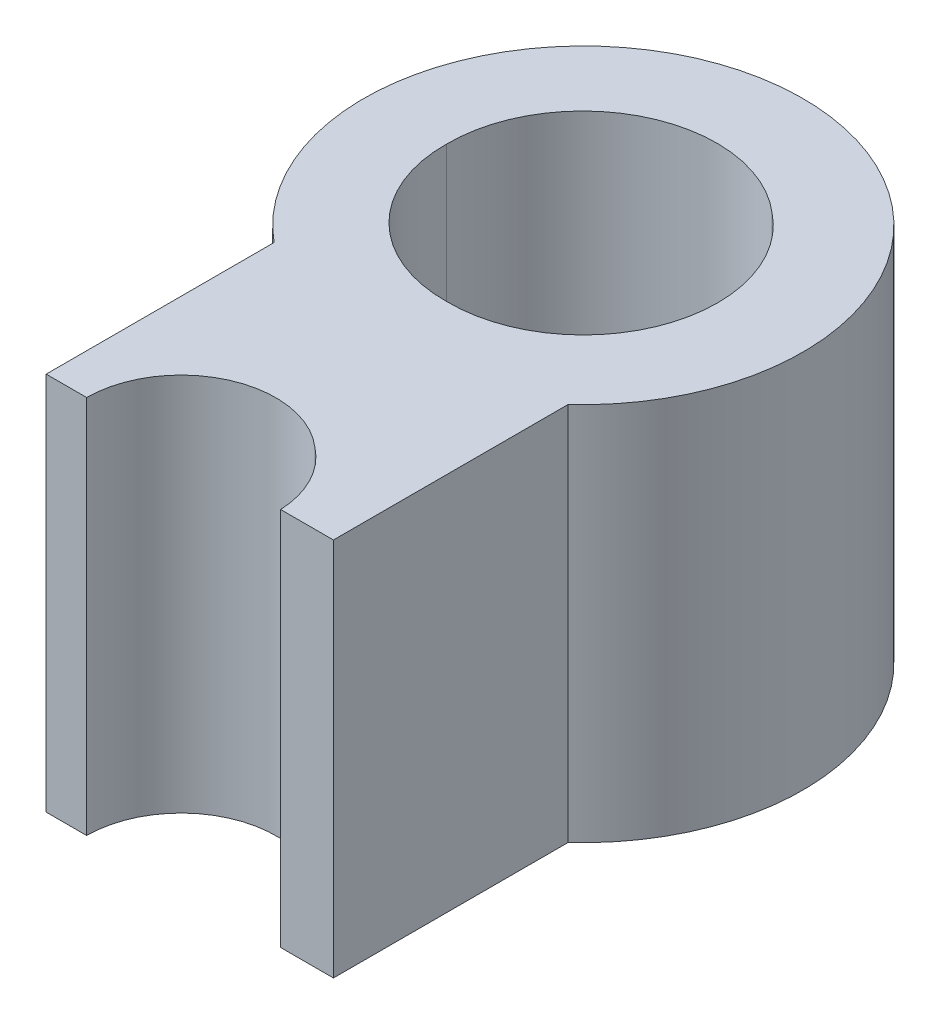
ISO-10303-21;
HEADER;
FILE_DESCRIPTION(('STEP AP214'),'2;1');
FILE_NAME('part.step','',(''),(''),'','','');
FILE_SCHEMA(('AUTOMOTIVE_DESIGN { 1 0 10303 214 1 1 1 1 }'));
ENDSEC;
DATA;
#1=APPLICATION_CONTEXT('core data for automotive mechanical design processes');
#2=APPLICATION_PROTOCOL_DEFINITION('international standard','automotive_design',2000,#1);
#3=PRODUCT_CONTEXT('',#1,'mechanical');
#4=PRODUCT('Part','Part','',(#3));
#5=PRODUCT_RELATED_PRODUCT_CATEGORY('part','',(#4));
#6=PRODUCT_DEFINITION_FORMATION('','',#4);
#7=PRODUCT_DEFINITION_CONTEXT('part definition',#1,'design');
#8=PRODUCT_DEFINITION('design','',#6,#7);
#9=PRODUCT_DEFINITION_SHAPE('','',#8);
#10=(LENGTH_UNIT() NAMED_UNIT(*) SI_UNIT(.MILLI.,.METRE.));
#11=(NAMED_UNIT(*) PLANE_ANGLE_UNIT() SI_UNIT($,.RADIAN.));
#12=(NAMED_UNIT(*) SI_UNIT($,.STERADIAN.) SOLID_ANGLE_UNIT());
#13=UNCERTAINTY_MEASURE_WITH_UNIT(LENGTH_MEASURE(1.E-05),#10,'distance_accuracy_value','');
#14=(GEOMETRIC_REPRESENTATION_CONTEXT(3) GLOBAL_UNCERTAINTY_ASSIGNED_CONTEXT((#13)) GLOBAL_UNIT_ASSIGNED_CONTEXT((#10,
#11,#12)) REPRESENTATION_CONTEXT('',''));
#15=CARTESIAN_POINT('',(0.,0.,0.));
#16=DIRECTION('',(0.,0.,1.));
#17=DIRECTION('',(1.,0.,0.));
#18=AXIS2_PLACEMENT_3D('',#15,#16,#17);
#19=CARTESIAN_POINT('',(1.26536763995187,2.87183105039429,15.59112871048));
#20=DIRECTION('',(0.,1.,0.));
#21=DIRECTION('',(0.,0.,-1.));
#22=AXIS2_PLACEMENT_3D('',#19,#20,#21);
#23=PLANE('',#22);
#24=CARTESIAN_POINT('',(1.19031731209146,2.87183105039429,23.2098996244558));
#25=DIRECTION('',(0.,1.,0.));
#26=DIRECTION('',(0.,0.,-1.));
#27=AXIS2_PLACEMENT_3D('',#24,#25,#26);
#28=CIRCLE('',#27,0.425);
#29=CARTESIAN_POINT('',(1.18339247602168,2.87183105039429,23.6348432049996));
#30=VERTEX_POINT('',#29);
#31=CARTESIAN_POINT('',(1.45442592549063,2.87183105039429,22.876925691049));
#32=VERTEX_POINT('',#31);
#33=EDGE_CURVE('E157',#30,#32,#28,.T.);
#34=ORIENTED_EDGE('',*,*,#33,.F.);
#35=CARTESIAN_POINT('',(1.17646763995184,2.87183105039429,23.2098996244558));
#36=DIRECTION('',(0.,1.,0.));
#37=DIRECTION('',(0.,0.,-1.));
#38=AXIS2_PLACEMENT_3D('',#35,#36,#37);
#39=CIRCLE('',#38,0.425);
#40=CARTESIAN_POINT('',(0.751506342263287,2.87183105039429,23.204164167467));
#41=VERTEX_POINT('',#40);
#42=EDGE_CURVE('E221',#41,#30,#39,.T.);
#43=ORIENTED_EDGE('',*,*,#42,.F.);
#44=CARTESIAN_POINT('',(1.17646763995186,2.87183105039429,23.1984287104753));
#45=DIRECTION('',(0.,1.,0.));
#46=DIRECTION('',(0.,0.,1.));
#47=AXIS2_PLACEMENT_3D('',#44,#45,#46);
#48=CIRCLE('',#47,0.425);
#49=EDGE_CURVE('E172',#32,#41,#48,.T.);
#50=ORIENTED_EDGE('',*,*,#49,.F.);
#51=EDGE_LOOP('',(#34,#43,#50));
#52=FACE_BOUND('',#51,.T.);
#53=CARTESIAN_POINT('',(1.19031731209146,2.87183105039429,24.4798996244558));
#54=DIRECTION('',(0.,1.,0.));
#55=DIRECTION('',(0.999103542626486,0.,-0.0423333333344528));
#56=AXIS2_PLACEMENT_3D('',#53,#54,#55);
#57=CIRCLE('',#56,0.30000000000001);
#58=CARTESIAN_POINT('',(1.49004837487942,2.87183105039429,24.4671996244555));
#59=VERTEX_POINT('',#58);
#60=CARTESIAN_POINT('',(1.37466706607375,2.87183105039429,24.2432243866157));
#61=VERTEX_POINT('',#60);
#62=EDGE_CURVE('E124',#59,#61,#57,.T.);
#63=ORIENTED_EDGE('',*,*,#62,.F.);
#64=DIRECTION('',(-1.,0.,-1.06337566312118E-12));
#65=VECTOR('',#64,1.);
#66=CARTESIAN_POINT('',(1.65713211597408,2.87183105039429,24.4671996244556));
#67=LINE('',#66,#65);
#68=CARTESIAN_POINT('',(1.65713211597408,2.87183105039429,24.4671996244556));
#69=VERTEX_POINT('',#68);
#70=EDGE_CURVE('E218',#69,#59,#67,.T.);
#71=ORIENTED_EDGE('',*,*,#70,.F.);
#72=DIRECTION('',(5.26442008312743E-13,0.,-1.));
#73=VECTOR('',#72,1.);
#74=CARTESIAN_POINT('',(1.65713211597408,2.87183105039429,24.4671996244556));
#75=LINE('',#74,#73);
#76=CARTESIAN_POINT('',(1.65713211597447,2.87183105039429,23.7245472516448));
#77=VERTEX_POINT('',#76);
#78=EDGE_CURVE('E25',#69,#77,#75,.T.);
#79=ORIENTED_EDGE('',*,*,#78,.T.);
#80=CARTESIAN_POINT('',(1.19031731209146,2.87183105039429,23.2098996244558));
#81=DIRECTION('',(0.,1.,0.));
#82=DIRECTION('',(0.,0.,-1.));
#83=AXIS2_PLACEMENT_3D('',#80,#81,#82);
#84=CIRCLE('',#83,0.694822453073876);
#85=CARTESIAN_POINT('',(0.74843822321197,2.87183105039429,23.7461095759735));
#86=VERTEX_POINT('',#85);
#87=EDGE_CURVE('E11',#77,#86,#84,.T.);
#88=ORIENTED_EDGE('',*,*,#87,.T.);
#89=DIRECTION('',(-5.91001814819049E-13,0.,-1.));
#90=VECTOR('',#89,1.);
#91=CARTESIAN_POINT('',(0.748438223212397,2.87183105039429,24.467199624456));
#92=LINE('',#91,#90);
#93=CARTESIAN_POINT('',(0.748438223212397,2.87183105039429,24.467199624456));
#94=VERTEX_POINT('',#93);
#95=EDGE_CURVE('E156',#94,#86,#92,.T.);
#96=ORIENTED_EDGE('',*,*,#95,.F.);
#97=DIRECTION('',(1.,0.,-1.62432664225037E-12));
#98=VECTOR('',#97,1.);
#99=CARTESIAN_POINT('',(0.748438223212397,2.87183105039429,24.467199624456));
#100=LINE('',#99,#98);
#101=CARTESIAN_POINT('',(0.876470157716526,2.87183105039429,24.4671996244558));
#102=VERTEX_POINT('',#101);
#103=EDGE_CURVE('E129',#94,#102,#100,.T.);
#104=ORIENTED_EDGE('',*,*,#103,.T.);
#105=CARTESIAN_POINT('',(1.17646763995187,2.87183105039429,24.4684287104753));
#106=DIRECTION('',(0.,1.,0.));
#107=DIRECTION('',(0.999103542626609,0.,0.0423333333315546));
#108=AXIS2_PLACEMENT_3D('',#105,#106,#107);
#109=CIRCLE('',#108,0.299999999999991);
#110=EDGE_CURVE('E128',#61,#102,#109,.T.);
#111=ORIENTED_EDGE('',*,*,#110,.F.);
#112=EDGE_LOOP('',(#63,#71,#79,#88,#96,#104,#111));
#113=FACE_BOUND('',#112,.T.);
#114=ADVANCED_FACE('F17',(#52,#113),#23,.T.);
#115=CARTESIAN_POINT('',(1.19031731209146,2.87183105039429,23.2098996244558));
#116=DIRECTION('',(0.,-1.,0.));
#117=DIRECTION('',(0.,0.,-1.));
#118=AXIS2_PLACEMENT_3D('',#115,#116,#117);
#119=CYLINDRICAL_SURFACE('',#118,0.694822453073876);
#120=CARTESIAN_POINT('',(1.19031731209146,1.6718310055699,23.2098996244558));
#121=DIRECTION('',(0.,1.,0.));
#122=DIRECTION('',(0.,0.,-1.));
#123=AXIS2_PLACEMENT_3D('',#120,#121,#122);
#124=CIRCLE('',#123,0.694822453073876);
#125=CARTESIAN_POINT('',(1.65713211597448,1.6718310055699,23.7245472516448));
#126=VERTEX_POINT('',#125);
#127=CARTESIAN_POINT('',(0.748438223211978,1.6718310055699,23.7461095759735));
#128=VERTEX_POINT('',#127);
#129=EDGE_CURVE('E161',#126,#128,#124,.T.);
#130=ORIENTED_EDGE('',*,*,#129,.T.);
#131=DIRECTION('',(0.,-1.,0.));
#132=VECTOR('',#131,1.);
#133=CARTESIAN_POINT('',(0.74843822321197,2.87183105039429,23.7461095759735));
#134=LINE('',#133,#132);
#135=EDGE_CURVE('E207',#86,#128,#134,.T.);
#136=ORIENTED_EDGE('',*,*,#135,.F.);
#137=ORIENTED_EDGE('',*,*,#87,.F.);
#138=DIRECTION('',(0.,-1.,0.));
#139=VECTOR('',#138,1.);
#140=CARTESIAN_POINT('',(1.65713211597447,2.87183105039429,23.7245472516448));
#141=LINE('',#140,#139);
#142=EDGE_CURVE('E215',#77,#126,#141,.T.);
#143=ORIENTED_EDGE('',*,*,#142,.T.);
#144=EDGE_LOOP('',(#130,#136,#137,#143));
#145=FACE_BOUND('',#144,.T.);
#146=ADVANCED_FACE('F238',(#145),#119,.T.);
#147=CARTESIAN_POINT('',(1.65713211597447,2.87183105039429,23.7245472516448));
#148=DIRECTION('',(1.,0.,5.26442008312743E-13));
#149=DIRECTION('',(-5.26442008312743E-13,0.,1.));
#150=AXIS2_PLACEMENT_3D('',#147,#148,#149);
#151=PLANE('',#150);
#152=DIRECTION('',(5.26442008312743E-13,0.,-1.));
#153=VECTOR('',#152,1.);
#154=CARTESIAN_POINT('',(1.65713211597661,1.6718310055699,19.6578379810625));
#155=LINE('',#154,#153);
#156=CARTESIAN_POINT('',(1.65713211597409,1.6718310055699,24.4671996244556));
#157=VERTEX_POINT('',#156);
#158=EDGE_CURVE('E168',#157,#126,#155,.T.);
#159=ORIENTED_EDGE('',*,*,#158,.T.);
#160=ORIENTED_EDGE('',*,*,#142,.F.);
#161=ORIENTED_EDGE('',*,*,#78,.F.);
#162=DIRECTION('',(0.,-1.,0.));
#163=VECTOR('',#162,1.);
#164=CARTESIAN_POINT('',(1.65713211597408,2.87183105039429,24.4671996244556));
#165=LINE('',#164,#163);
#166=EDGE_CURVE('E224',#69,#157,#165,.T.);
#167=ORIENTED_EDGE('',*,*,#166,.T.);
#168=EDGE_LOOP('',(#159,#160,#161,#167));
#169=FACE_BOUND('',#168,.T.);
#170=ADVANCED_FACE('F236',(#169),#151,.T.);
#171=CARTESIAN_POINT('',(1.65713211597408,2.87183105039429,24.4671996244556));
#172=DIRECTION('',(-1.06337566312118E-12,0.,1.));
#173=DIRECTION('',(1.,0.,1.06337566312118E-12));
#174=AXIS2_PLACEMENT_3D('',#171,#172,#173);
#175=PLANE('',#174);
#176=DIRECTION('',(1.,0.,1.06337566312118E-12));
#177=VECTOR('',#176,1.);
#178=CARTESIAN_POINT('',(1.46124987795826,1.6718310055699,24.4671996244554));
#179=LINE('',#178,#177);
#180=CARTESIAN_POINT('',(1.49004837487942,1.6718310055699,24.4671996244555));
#181=VERTEX_POINT('',#180);
#182=EDGE_CURVE('E146',#181,#157,#179,.T.);
#183=ORIENTED_EDGE('',*,*,#182,.T.);
#184=ORIENTED_EDGE('',*,*,#166,.F.);
#185=ORIENTED_EDGE('',*,*,#70,.T.);
#186=DIRECTION('',(0.,-1.,0.));
#187=VECTOR('',#186,1.);
#188=CARTESIAN_POINT('',(1.49004837487942,2.87183105039429,24.4671996244555));
#189=LINE('',#188,#187);
#190=EDGE_CURVE('E201',#59,#181,#189,.T.);
#191=ORIENTED_EDGE('',*,*,#190,.T.);
#192=EDGE_LOOP('',(#183,#184,#185,#191));
#193=FACE_BOUND('',#192,.T.);
#194=ADVANCED_FACE('F326',(#193),#175,.T.);
#195=CARTESIAN_POINT('',(1.17646763995184,2.87183105039429,23.2098996244558));
#196=DIRECTION('',(0.,-1.,0.));
#197=DIRECTION('',(-0.706116546064859,0.,0.708095631516982));
#198=AXIS2_PLACEMENT_3D('',#195,#196,#197);
#199=CYLINDRICAL_SURFACE('',#198,0.425);
#200=CARTESIAN_POINT('',(1.17646763995184,1.6718310055699,23.2098996244558));
#201=DIRECTION('',(0.,-1.,0.));
#202=DIRECTION('',(0.,0.,-1.));
#203=AXIS2_PLACEMENT_3D('',#200,#201,#202);
#204=CIRCLE('',#203,0.425);
#205=CARTESIAN_POINT('',(1.18339247602169,1.6718310055699,23.6348432049996));
#206=VERTEX_POINT('',#205);
#207=CARTESIAN_POINT('',(0.751506342263295,1.6718310055699,23.204164167467));
#208=VERTEX_POINT('',#207);
#209=EDGE_CURVE('E173',#206,#208,#204,.T.);
#210=ORIENTED_EDGE('',*,*,#209,.T.);
#211=DIRECTION('',(0.,-1.,0.));
#212=VECTOR('',#211,1.);
#213=CARTESIAN_POINT('',(0.751506342263287,2.87183105039429,23.204164167467));
#214=LINE('',#213,#212);
#215=EDGE_CURVE('E193',#41,#208,#214,.T.);
#216=ORIENTED_EDGE('',*,*,#215,.F.);
#217=ORIENTED_EDGE('',*,*,#42,.T.);
#218=DIRECTION('',(0.,-1.,0.));
#219=VECTOR('',#218,1.);
#220=CARTESIAN_POINT('',(1.18339247602168,2.87183105039429,23.6348432049996));
#221=LINE('',#220,#219);
#222=EDGE_CURVE('E196',#30,#206,#221,.T.);
#223=ORIENTED_EDGE('',*,*,#222,.T.);
#224=EDGE_LOOP('',(#210,#216,#217,#223));
#225=FACE_BOUND('',#224,.T.);
#226=ADVANCED_FACE('F269',(#225),#199,.F.);
#227=CARTESIAN_POINT('',(1.19031731209146,2.87183105039429,24.4798996244558));
#228=DIRECTION('',(0.,-1.,0.));
#229=DIRECTION('',(0.999103542626486,0.,-0.0423333333344528));
#230=AXIS2_PLACEMENT_3D('',#227,#228,#229);
#231=CYLINDRICAL_SURFACE('',#230,0.30000000000001);
#232=CARTESIAN_POINT('',(1.19031731209146,1.6718310055699,24.4798996244558));
#233=DIRECTION('',(0.,-1.,0.));
#234=DIRECTION('',(0.999103542626486,0.,-0.0423333333344528));
#235=AXIS2_PLACEMENT_3D('',#232,#233,#234);
#236=CIRCLE('',#235,0.30000000000001);
#237=CARTESIAN_POINT('',(1.37466706607376,1.6718310055699,24.2432243866157));
#238=VERTEX_POINT('',#237);
#239=EDGE_CURVE('E122',#238,#181,#236,.T.);
#240=ORIENTED_EDGE('',*,*,#239,.T.);
#241=ORIENTED_EDGE('',*,*,#190,.F.);
#242=ORIENTED_EDGE('',*,*,#62,.T.);
#243=DIRECTION('',(0.,-1.,0.));
#244=VECTOR('',#243,1.);
#245=CARTESIAN_POINT('',(1.37466706607375,2.87183105039429,24.2432243866157));
#246=LINE('',#245,#244);
#247=EDGE_CURVE('E117',#61,#238,#246,.T.);
#248=ORIENTED_EDGE('',*,*,#247,.T.);
#249=EDGE_LOOP('',(#240,#241,#242,#248));
#250=FACE_BOUND('',#249,.T.);
#251=ADVANCED_FACE('F119',(#250),#231,.F.);
#252=CARTESIAN_POINT('',(1.17646763995187,2.87183105039429,24.4684287104753));
#253=DIRECTION('',(0.,-1.,0.));
#254=DIRECTION('',(-0.410039806312854,0.,-0.912067627557802));
#255=AXIS2_PLACEMENT_3D('',#252,#253,#254);
#256=CYLINDRICAL_SURFACE('',#255,0.299999999999991);
#257=CARTESIAN_POINT('',(1.17646763995187,1.6718310055699,24.4684287104753));
#258=DIRECTION('',(0.,-1.,0.));
#259=DIRECTION('',(0.999103542626609,0.,0.0423333333315546));
#260=AXIS2_PLACEMENT_3D('',#257,#258,#259);
#261=CIRCLE('',#260,0.299999999999991);
#262=CARTESIAN_POINT('',(0.876470157716533,1.6718310055699,24.4671996244558));
#263=VERTEX_POINT('',#262);
#264=EDGE_CURVE('E132',#263,#238,#261,.T.);
#265=ORIENTED_EDGE('',*,*,#264,.T.);
#266=ORIENTED_EDGE('',*,*,#247,.F.);
#267=ORIENTED_EDGE('',*,*,#110,.T.);
#268=DIRECTION('',(0.,-1.,0.));
#269=VECTOR('',#268,1.);
#270=CARTESIAN_POINT('',(0.876470157716526,2.87183105039429,24.4671996244558));
#271=LINE('',#270,#269);
#272=EDGE_CURVE('E135',#102,#263,#271,.T.);
#273=ORIENTED_EDGE('',*,*,#272,.T.);
#274=EDGE_LOOP('',(#265,#266,#267,#273));
#275=FACE_BOUND('',#274,.T.);
#276=ADVANCED_FACE('F133',(#275),#256,.F.);
#277=CARTESIAN_POINT('',(0.876470157716526,2.87183105039429,24.4671996244558));
#278=DIRECTION('',(1.62432664225037E-12,0.,1.));
#279=DIRECTION('',(1.,0.,-1.62432664225037E-12));
#280=AXIS2_PLACEMENT_3D('',#277,#278,#279);
#281=PLANE('',#280);
#282=DIRECTION('',(1.,0.,-1.62432664225037E-12));
#283=VECTOR('',#282,1.);
#284=CARTESIAN_POINT('',(1.07091889884141,1.6718310055699,24.4671996244555));
#285=LINE('',#284,#283);
#286=CARTESIAN_POINT('',(0.748438223212404,1.6718310055699,24.467199624456));
#287=VERTEX_POINT('',#286);
#288=EDGE_CURVE('E140',#287,#263,#285,.T.);
#289=ORIENTED_EDGE('',*,*,#288,.T.);
#290=ORIENTED_EDGE('',*,*,#272,.F.);
#291=ORIENTED_EDGE('',*,*,#103,.F.);
#292=DIRECTION('',(0.,-1.,0.));
#293=VECTOR('',#292,1.);
#294=CARTESIAN_POINT('',(0.748438223212397,2.87183105039429,24.467199624456));
#295=LINE('',#294,#293);
#296=EDGE_CURVE('E153',#94,#287,#295,.T.);
#297=ORIENTED_EDGE('',*,*,#296,.T.);
#298=EDGE_LOOP('',(#289,#290,#291,#297));
#299=FACE_BOUND('',#298,.T.);
#300=ADVANCED_FACE('F244',(#299),#281,.T.);
#301=CARTESIAN_POINT('',(0.748438223212397,2.87183105039429,24.467199624456));
#302=DIRECTION('',(-1.,0.,5.91001814819049E-13));
#303=DIRECTION('',(0.,1.,0.));
#304=AXIS2_PLACEMENT_3D('',#301,#302,#303);
#305=PLANE('',#304);
#306=DIRECTION('',(5.91001814819049E-13,0.,1.));
#307=VECTOR('',#306,1.);
#308=CARTESIAN_POINT('',(0.748438223209774,1.6718310055699,20.0291641674682));
#309=LINE('',#308,#307);
#310=EDGE_CURVE('E158',#128,#287,#309,.T.);
#311=ORIENTED_EDGE('',*,*,#310,.T.);
#312=ORIENTED_EDGE('',*,*,#296,.F.);
#313=ORIENTED_EDGE('',*,*,#95,.T.);
#314=ORIENTED_EDGE('',*,*,#135,.T.);
#315=EDGE_LOOP('',(#311,#312,#313,#314));
#316=FACE_BOUND('',#315,.T.);
#317=ADVANCED_FACE('F242',(#316),#305,.T.);
#318=CARTESIAN_POINT('',(1.19031731209146,2.87183105039429,23.2098996244558));
#319=DIRECTION('',(0.,-1.,0.));
#320=DIRECTION('',(0.941604647657705,0.,0.336720488698578));
#321=AXIS2_PLACEMENT_3D('',#318,#319,#320);
#322=CYLINDRICAL_SURFACE('',#321,0.425);
#323=CARTESIAN_POINT('',(1.19031731209146,1.6718310055699,23.2098996244558));
#324=DIRECTION('',(0.,-1.,0.));
#325=DIRECTION('',(0.,0.,-1.));
#326=AXIS2_PLACEMENT_3D('',#323,#324,#325);
#327=CIRCLE('',#326,0.425);
#328=CARTESIAN_POINT('',(1.45442592549064,1.6718310055699,22.876925691049));
#329=VERTEX_POINT('',#328);
#330=EDGE_CURVE('E179',#329,#206,#327,.T.);
#331=ORIENTED_EDGE('',*,*,#330,.T.);
#332=ORIENTED_EDGE('',*,*,#222,.F.);
#333=ORIENTED_EDGE('',*,*,#33,.T.);
#334=DIRECTION('',(0.,-1.,0.));
#335=VECTOR('',#334,1.);
#336=CARTESIAN_POINT('',(1.45442592549063,2.87183105039429,22.876925691049));
#337=LINE('',#336,#335);
#338=EDGE_CURVE('E169',#32,#329,#337,.T.);
#339=ORIENTED_EDGE('',*,*,#338,.T.);
#340=EDGE_LOOP('',(#331,#332,#333,#339));
#341=FACE_BOUND('',#340,.T.);
#342=ADVANCED_FACE('F252',(#341),#322,.F.);
#343=CARTESIAN_POINT('',(1.17646763995186,2.87183105039429,23.1984287104753));
#344=DIRECTION('',(0.,-1.,0.));
#345=DIRECTION('',(-0.422047908904971,0.,-0.906573528506619));
#346=AXIS2_PLACEMENT_3D('',#343,#344,#345);
#347=CYLINDRICAL_SURFACE('',#346,0.425);
#348=CARTESIAN_POINT('',(1.17646763995186,1.6718310055699,23.1984287104753));
#349=DIRECTION('',(0.,-1.,0.));
#350=DIRECTION('',(0.,0.,1.));
#351=AXIS2_PLACEMENT_3D('',#348,#349,#350);
#352=CIRCLE('',#351,0.425);
#353=EDGE_CURVE('E180',#208,#329,#352,.T.);
#354=ORIENTED_EDGE('',*,*,#353,.T.);
#355=ORIENTED_EDGE('',*,*,#338,.F.);
#356=ORIENTED_EDGE('',*,*,#49,.T.);
#357=ORIENTED_EDGE('',*,*,#215,.T.);
#358=EDGE_LOOP('',(#354,#355,#356,#357));
#359=FACE_BOUND('',#358,.T.);
#360=ADVANCED_FACE('F273',(#359),#347,.F.);
#361=CARTESIAN_POINT('',(1.26536763995188,1.6718310055699,15.59112871048));
#362=DIRECTION('',(0.,1.,0.));
#363=DIRECTION('',(0.,0.,-1.));
#364=AXIS2_PLACEMENT_3D('',#361,#362,#363);
#365=PLANE('',#364);
#366=ORIENTED_EDGE('',*,*,#330,.F.);
#367=ORIENTED_EDGE('',*,*,#353,.F.);
#368=ORIENTED_EDGE('',*,*,#209,.F.);
#369=EDGE_LOOP('',(#366,#367,#368));
#370=FACE_BOUND('',#369,.T.);
#371=ORIENTED_EDGE('',*,*,#239,.F.);
#372=ORIENTED_EDGE('',*,*,#264,.F.);
#373=ORIENTED_EDGE('',*,*,#288,.F.);
#374=ORIENTED_EDGE('',*,*,#310,.F.);
#375=ORIENTED_EDGE('',*,*,#129,.F.);
#376=ORIENTED_EDGE('',*,*,#158,.F.);
#377=ORIENTED_EDGE('',*,*,#182,.F.);
#378=EDGE_LOOP('',(#371,#372,#373,#374,#375,#376,#377));
#379=FACE_BOUND('',#378,.T.);
#380=ADVANCED_FACE('F143',(#370,#379),#365,.F.);
#381=CLOSED_SHELL('',(#114,#146,#170,#194,#226,#251,#276,#300,#317,#342,#360,#380));
#382=MANIFOLD_SOLID_BREP('B1',#381);
#383=ADVANCED_BREP_SHAPE_REPRESENTATION('',(#18,#382),#14);
#384=SHAPE_DEFINITION_REPRESENTATION(#9,#383);
ENDSEC;
END-ISO-10303-21;
